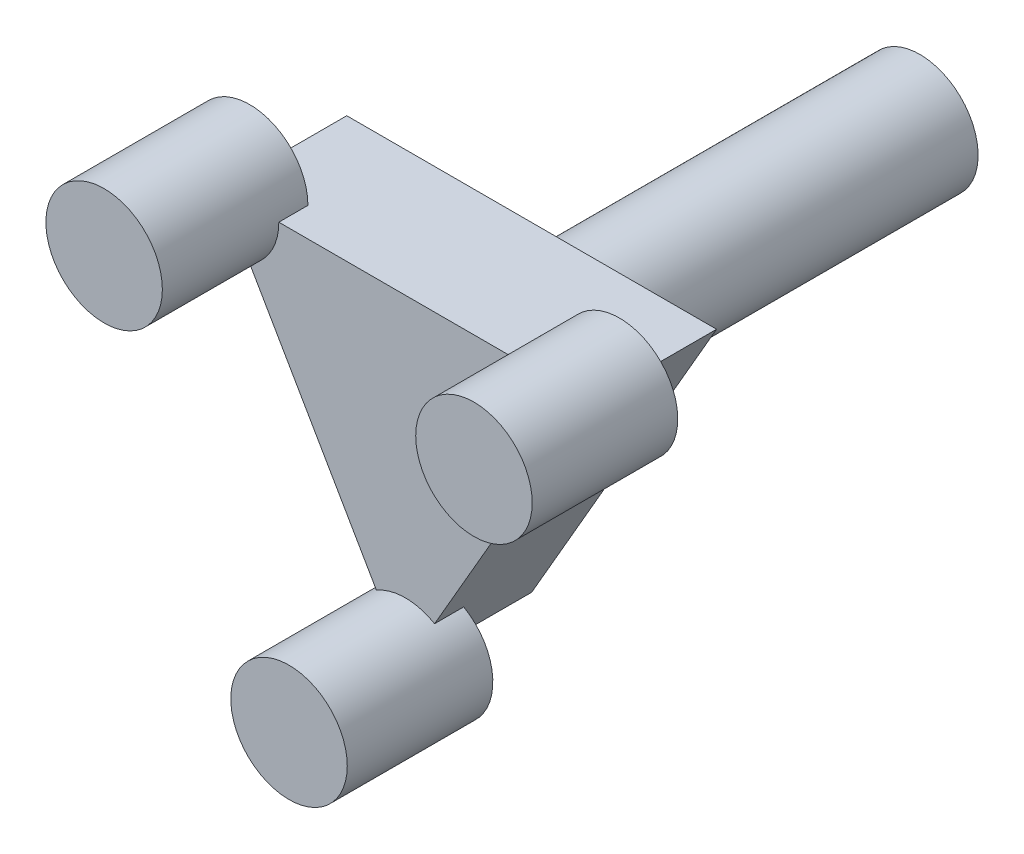
ISO-10303-21;
HEADER;
FILE_DESCRIPTION(('STEP AP214'),'2;1');
FILE_NAME('part.step','',(''),(''),'','','');
FILE_SCHEMA(('AUTOMOTIVE_DESIGN { 1 0 10303 214 1 1 1 1 }'));
ENDSEC;
DATA;
#1=APPLICATION_CONTEXT('core data for automotive mechanical design processes');
#2=APPLICATION_PROTOCOL_DEFINITION('international standard','automotive_design',2000,#1);
#3=PRODUCT_CONTEXT('',#1,'mechanical');
#4=PRODUCT('Part','Part','',(#3));
#5=PRODUCT_RELATED_PRODUCT_CATEGORY('part','',(#4));
#6=PRODUCT_DEFINITION_FORMATION('','',#4);
#7=PRODUCT_DEFINITION_CONTEXT('part definition',#1,'design');
#8=PRODUCT_DEFINITION('design','',#6,#7);
#9=PRODUCT_DEFINITION_SHAPE('','',#8);
#10=(LENGTH_UNIT() NAMED_UNIT(*) SI_UNIT(.MILLI.,.METRE.));
#11=(NAMED_UNIT(*) PLANE_ANGLE_UNIT() SI_UNIT($,.RADIAN.));
#12=(NAMED_UNIT(*) SI_UNIT($,.STERADIAN.) SOLID_ANGLE_UNIT());
#13=UNCERTAINTY_MEASURE_WITH_UNIT(LENGTH_MEASURE(1.E-05),#10,'distance_accuracy_value','');
#14=(GEOMETRIC_REPRESENTATION_CONTEXT(3) GLOBAL_UNCERTAINTY_ASSIGNED_CONTEXT((#13)) GLOBAL_UNIT_ASSIGNED_CONTEXT((#10,
#11,#12)) REPRESENTATION_CONTEXT('',''));
#15=CARTESIAN_POINT('',(0.,0.,0.));
#16=DIRECTION('',(0.,0.,1.));
#17=DIRECTION('',(1.,0.,0.));
#18=AXIS2_PLACEMENT_3D('',#15,#16,#17);
#19=CARTESIAN_POINT('',(-19.0525588832587,-10.9999999999975,-9.99999999999996));
#20=DIRECTION('',(0.,-1.,0.));
#21=DIRECTION('',(0.,0.,-1.));
#22=AXIS2_PLACEMENT_3D('',#19,#20,#21);
#23=PLANE('',#22);
#24=DIRECTION('',(0.,0.,-1.));
#25=VECTOR('',#24,1.);
#26=CARTESIAN_POINT('',(-13.0525588832545,-10.9999999999975,15.));
#27=LINE('',#26,#25);
#28=CARTESIAN_POINT('',(-13.0525588832545,-10.9999999999975,3.));
#29=VERTEX_POINT('',#28);
#30=CARTESIAN_POINT('',(-13.0525588832545,-10.9999999999975,0.));
#31=VERTEX_POINT('',#30);
#32=EDGE_CURVE('E126',#29,#31,#27,.T.);
#33=ORIENTED_EDGE('',*,*,#32,.F.);
#34=DIRECTION('',(1.,0.,0.));
#35=VECTOR('',#34,1.);
#36=CARTESIAN_POINT('',(-19.0525588832587,-10.9999999999975,3.));
#37=LINE('',#36,#35);
#38=CARTESIAN_POINT('',(13.0525588832415,-10.9999999999975,3.));
#39=VERTEX_POINT('',#38);
#40=EDGE_CURVE('E114',#29,#39,#37,.T.);
#41=ORIENTED_EDGE('',*,*,#40,.T.);
#42=DIRECTION('',(0.,0.,-1.));
#43=VECTOR('',#42,1.);
#44=CARTESIAN_POINT('',(13.0525588832415,-10.9999999999975,15.));
#45=LINE('',#44,#43);
#46=CARTESIAN_POINT('',(13.0525588832415,-10.9999999999975,0.));
#47=VERTEX_POINT('',#46);
#48=EDGE_CURVE('E203',#47,#39,#45,.F.);
#49=ORIENTED_EDGE('',*,*,#48,.F.);
#50=DIRECTION('',(-1.,0.,0.));
#51=VECTOR('',#50,1.);
#52=CARTESIAN_POINT('',(-19.0525588832587,-10.9999999999975,0.));
#53=LINE('',#52,#51);
#54=CARTESIAN_POINT('',(19.0525588832485,-10.9999999999975,0.));
#55=VERTEX_POINT('',#54);
#56=EDGE_CURVE('E134',#55,#47,#53,.T.);
#57=ORIENTED_EDGE('',*,*,#56,.F.);
#58=DIRECTION('',(0.,0.,1.));
#59=VECTOR('',#58,1.);
#60=CARTESIAN_POINT('',(19.0525588832485,-10.9999999999975,-9.99999999999996));
#61=LINE('',#60,#59);
#62=CARTESIAN_POINT('',(19.0525588832485,-10.9999999999975,-9.99999999999996));
#63=VERTEX_POINT('',#62);
#64=EDGE_CURVE('E170',#63,#55,#61,.T.);
#65=ORIENTED_EDGE('',*,*,#64,.F.);
#66=DIRECTION('',(1.,0.,0.));
#67=VECTOR('',#66,1.);
#68=CARTESIAN_POINT('',(-19.0525588832587,-10.9999999999975,-9.99999999999996));
#69=LINE('',#68,#67);
#70=CARTESIAN_POINT('',(-19.0525588832587,-10.9999999999975,-9.99999999999996));
#71=VERTEX_POINT('',#70);
#72=EDGE_CURVE('E185',#71,#63,#69,.T.);
#73=ORIENTED_EDGE('',*,*,#72,.F.);
#74=DIRECTION('',(0.,0.,1.));
#75=VECTOR('',#74,1.);
#76=CARTESIAN_POINT('',(-19.0525588832587,-10.9999999999975,-9.99999999999996));
#77=LINE('',#76,#75);
#78=CARTESIAN_POINT('',(-19.0525588832587,-10.9999999999975,0.));
#79=VERTEX_POINT('',#78);
#80=EDGE_CURVE('E178',#71,#79,#77,.T.);
#81=ORIENTED_EDGE('',*,*,#80,.T.);
#82=DIRECTION('',(-1.,0.,0.));
#83=VECTOR('',#82,1.);
#84=CARTESIAN_POINT('',(-19.0525588832587,-10.9999999999975,0.));
#85=LINE('',#84,#83);
#86=EDGE_CURVE('E56',#31,#79,#85,.T.);
#87=ORIENTED_EDGE('',*,*,#86,.F.);
#88=EDGE_LOOP('',(#33,#41,#49,#57,#65,#73,#81,#87));
#89=FACE_BOUND('',#88,.T.);
#90=ADVANCED_FACE('F39',(#89),#23,.F.);
#91=CARTESIAN_POINT('',(-4.61615936060342E-12,-43.9999999999913,-9.99999999999996));
#92=DIRECTION('',(0.866025403784439,0.5,0.));
#93=DIRECTION('',(-0.5,0.866025403784439,0.));
#94=AXIS2_PLACEMENT_3D('',#91,#92,#93);
#95=PLANE('',#94);
#96=DIRECTION('',(0.,0.,-1.));
#97=VECTOR('',#96,1.);
#98=CARTESIAN_POINT('',(-16.0525588832566,-16.1961524227078,15.));
#99=LINE('',#98,#97);
#100=CARTESIAN_POINT('',(-16.0525588832566,-16.1961524227078,0.));
#101=VERTEX_POINT('',#100);
#102=CARTESIAN_POINT('',(-16.0525588832566,-16.1961524227078,3.));
#103=VERTEX_POINT('',#102);
#104=EDGE_CURVE('E64',#101,#103,#99,.F.);
#105=ORIENTED_EDGE('',*,*,#104,.F.);
#106=DIRECTION('',(0.5,-0.866025403784439,0.));
#107=VECTOR('',#106,1.);
#108=CARTESIAN_POINT('',(-4.61615936060342E-12,-43.9999999999913,0.));
#109=LINE('',#108,#107);
#110=EDGE_CURVE('E43',#79,#101,#109,.T.);
#111=ORIENTED_EDGE('',*,*,#110,.F.);
#112=ORIENTED_EDGE('',*,*,#80,.F.);
#113=DIRECTION('',(-0.5,0.866025403784439,0.));
#114=VECTOR('',#113,1.);
#115=CARTESIAN_POINT('',(-4.61615936060342E-12,-43.9999999999913,-9.99999999999996));
#116=LINE('',#115,#114);
#117=CARTESIAN_POINT('',(-4.61615936060342E-12,-43.9999999999913,-9.99999999999996));
#118=VERTEX_POINT('',#117);
#119=EDGE_CURVE('E181',#118,#71,#116,.T.);
#120=ORIENTED_EDGE('',*,*,#119,.F.);
#121=DIRECTION('',(0.,0.,1.));
#122=VECTOR('',#121,1.);
#123=CARTESIAN_POINT('',(-4.61615936060342E-12,-43.9999999999913,-9.99999999999996));
#124=LINE('',#123,#122);
#125=CARTESIAN_POINT('',(-4.61532925508023E-12,-43.9999999999913,0.));
#126=VERTEX_POINT('',#125);
#127=EDGE_CURVE('E174',#118,#126,#124,.T.);
#128=ORIENTED_EDGE('',*,*,#127,.T.);
#129=DIRECTION('',(-0.5,0.866025403784439,0.));
#130=VECTOR('',#129,1.);
#131=CARTESIAN_POINT('',(-4.61615936060342E-12,-43.9999999999913,0.));
#132=LINE('',#131,#130);
#133=CARTESIAN_POINT('',(-3.00000000000237,-38.8038475772886,0.));
#134=VERTEX_POINT('',#133);
#135=EDGE_CURVE('E150',#126,#134,#132,.T.);
#136=ORIENTED_EDGE('',*,*,#135,.T.);
#137=DIRECTION('',(0.,0.,-1.));
#138=VECTOR('',#137,1.);
#139=CARTESIAN_POINT('',(-3.00000000000237,-38.8038475772886,15.));
#140=LINE('',#139,#138);
#141=CARTESIAN_POINT('',(-3.00000000000237,-38.8038475772886,3.));
#142=VERTEX_POINT('',#141);
#143=EDGE_CURVE('E166',#134,#142,#140,.F.);
#144=ORIENTED_EDGE('',*,*,#143,.T.);
#145=DIRECTION('',(-0.5,0.866025403784439,0.));
#146=VECTOR('',#145,1.);
#147=CARTESIAN_POINT('',(-4.61615936060342E-12,-43.9999999999913,3.));
#148=LINE('',#147,#146);
#149=EDGE_CURVE('E182',#142,#103,#148,.T.);
#150=ORIENTED_EDGE('',*,*,#149,.T.);
#151=EDGE_LOOP('',(#105,#111,#112,#120,#128,#136,#144,#150));
#152=FACE_BOUND('',#151,.T.);
#153=ADVANCED_FACE('F260',(#152),#95,.F.);
#154=CARTESIAN_POINT('',(19.0525588832485,-10.9999999999975,-9.99999999999996));
#155=DIRECTION('',(-0.866025403784449,0.499999999999981,0.));
#156=DIRECTION('',(-0.499999999999981,-0.866025403784449,0.));
#157=AXIS2_PLACEMENT_3D('',#154,#155,#156);
#158=PLANE('',#157);
#159=DIRECTION('',(0.,0.,-1.));
#160=VECTOR('',#159,1.);
#161=CARTESIAN_POINT('',(16.0525588832451,-16.1961524227103,15.));
#162=LINE('',#161,#160);
#163=CARTESIAN_POINT('',(16.0525588832451,-16.1961524227103,3.));
#164=VERTEX_POINT('',#163);
#165=CARTESIAN_POINT('',(16.0525588832451,-16.1961524227103,0.));
#166=VERTEX_POINT('',#165);
#167=EDGE_CURVE('E199',#164,#166,#162,.T.);
#168=ORIENTED_EDGE('',*,*,#167,.F.);
#169=DIRECTION('',(-0.499999999999981,-0.866025403784449,0.));
#170=VECTOR('',#169,1.);
#171=CARTESIAN_POINT('',(19.0525588832485,-10.9999999999975,3.));
#172=LINE('',#171,#170);
#173=CARTESIAN_POINT('',(2.99999999999303,-38.8038475772885,3.));
#174=VERTEX_POINT('',#173);
#175=EDGE_CURVE('E123',#164,#174,#172,.T.);
#176=ORIENTED_EDGE('',*,*,#175,.T.);
#177=DIRECTION('',(0.,0.,-1.));
#178=VECTOR('',#177,1.);
#179=CARTESIAN_POINT('',(2.99999999999302,-38.8038475772885,15.));
#180=LINE('',#179,#178);
#181=CARTESIAN_POINT('',(2.99999999999303,-38.8038475772885,0.));
#182=VERTEX_POINT('',#181);
#183=EDGE_CURVE('E159',#174,#182,#180,.T.);
#184=ORIENTED_EDGE('',*,*,#183,.T.);
#185=DIRECTION('',(-0.499999999999981,-0.866025403784449,0.));
#186=VECTOR('',#185,1.);
#187=CARTESIAN_POINT('',(-4.61615936060342E-12,-43.9999999999913,0.));
#188=LINE('',#187,#186);
#189=EDGE_CURVE('E146',#182,#126,#188,.T.);
#190=ORIENTED_EDGE('',*,*,#189,.T.);
#191=ORIENTED_EDGE('',*,*,#127,.F.);
#192=DIRECTION('',(-0.499999999999981,-0.866025403784449,0.));
#193=VECTOR('',#192,1.);
#194=CARTESIAN_POINT('',(19.0525588832485,-10.9999999999975,-9.99999999999996));
#195=LINE('',#194,#193);
#196=EDGE_CURVE('E190',#63,#118,#195,.T.);
#197=ORIENTED_EDGE('',*,*,#196,.F.);
#198=ORIENTED_EDGE('',*,*,#64,.T.);
#199=DIRECTION('',(0.499999999999981,0.866025403784449,0.));
#200=VECTOR('',#199,1.);
#201=CARTESIAN_POINT('',(19.0525588832485,-10.9999999999975,0.));
#202=LINE('',#201,#200);
#203=EDGE_CURVE('E124',#166,#55,#202,.T.);
#204=ORIENTED_EDGE('',*,*,#203,.F.);
#205=EDGE_LOOP('',(#168,#176,#184,#190,#191,#197,#198,#204));
#206=FACE_BOUND('',#205,.T.);
#207=ADVANCED_FACE('F251',(#206),#158,.F.);
#208=CARTESIAN_POINT('',(-4.61615936060342E-12,-43.9999999999913,15.));
#209=DIRECTION('',(0.,0.,-1.));
#210=DIRECTION('',(-1.,0.,0.));
#211=AXIS2_PLACEMENT_3D('',#208,#209,#210);
#212=CYLINDRICAL_SURFACE('',#211,5.99999999999551);
#213=CARTESIAN_POINT('',(-4.61615936060342E-12,-43.9999999999913,15.));
#214=DIRECTION('',(0.,0.,1.));
#215=DIRECTION('',(1.,0.,0.));
#216=AXIS2_PLACEMENT_3D('',#213,#214,#215);
#217=CIRCLE('',#216,5.99999999999551);
#218=CARTESIAN_POINT('',(5.99999999999089,-43.9999999999913,15.));
#219=VERTEX_POINT('',#218);
#220=EDGE_CURVE('E154',#219,#219,#217,.T.);
#221=ORIENTED_EDGE('',*,*,#220,.F.);
#222=EDGE_LOOP('',(#221));
#223=FACE_BOUND('',#222,.T.);
#224=ORIENTED_EDGE('',*,*,#183,.F.);
#225=CARTESIAN_POINT('',(-4.61615936060342E-12,-43.9999999999913,3.));
#226=DIRECTION('',(0.,0.,-1.));
#227=DIRECTION('',(-1.,0.,0.));
#228=AXIS2_PLACEMENT_3D('',#225,#226,#227);
#229=CIRCLE('',#228,5.99999999999551);
#230=EDGE_CURVE('E142',#142,#174,#229,.T.);
#231=ORIENTED_EDGE('',*,*,#230,.F.);
#232=ORIENTED_EDGE('',*,*,#143,.F.);
#233=CARTESIAN_POINT('',(-4.61615936060342E-12,-43.9999999999913,0.));
#234=DIRECTION('',(0.,0.,1.));
#235=DIRECTION('',(1.,0.,0.));
#236=AXIS2_PLACEMENT_3D('',#233,#234,#235);
#237=CIRCLE('',#236,5.99999999999551);
#238=EDGE_CURVE('E155',#134,#182,#237,.T.);
#239=ORIENTED_EDGE('',*,*,#238,.T.);
#240=EDGE_LOOP('',(#224,#231,#232,#239));
#241=FACE_BOUND('',#240,.T.);
#242=ADVANCED_FACE('F41',(#223,#241),#212,.T.);
#243=CARTESIAN_POINT('',(-4.61615936060342E-12,-43.9999999999913,0.));
#244=DIRECTION('',(0.,0.,1.));
#245=DIRECTION('',(1.,0.,0.));
#246=AXIS2_PLACEMENT_3D('',#243,#244,#245);
#247=PLANE('',#246);
#248=ORIENTED_EDGE('',*,*,#189,.F.);
#249=ORIENTED_EDGE('',*,*,#238,.F.);
#250=ORIENTED_EDGE('',*,*,#135,.F.);
#251=EDGE_LOOP('',(#248,#249,#250));
#252=FACE_BOUND('',#251,.T.);
#253=ADVANCED_FACE('F262',(#252),#247,.F.);
#254=CARTESIAN_POINT('',(-4.61615936060342E-12,-43.9999999999913,15.));
#255=DIRECTION('',(0.,0.,1.));
#256=DIRECTION('',(1.,0.,0.));
#257=AXIS2_PLACEMENT_3D('',#254,#255,#256);
#258=PLANE('',#257);
#259=ORIENTED_EDGE('',*,*,#220,.T.);
#260=EDGE_LOOP('',(#259));
#261=FACE_BOUND('',#260,.T.);
#262=ADVANCED_FACE('F242',(#261),#258,.T.);
#263=CARTESIAN_POINT('',(0.,0.,-9.99999999999996));
#264=DIRECTION('',(0.,0.,-1.));
#265=DIRECTION('',(-1.,0.,0.));
#266=AXIS2_PLACEMENT_3D('',#263,#264,#265);
#267=PLANE('',#266);
#268=CARTESIAN_POINT('',(0.,-21.9999999999983,-9.99999999999996));
#269=DIRECTION('',(0.,0.,-1.));
#270=DIRECTION('',(-1.,0.,0.));
#271=AXIS2_PLACEMENT_3D('',#268,#269,#270);
#272=CIRCLE('',#271,6.);
#273=CARTESIAN_POINT('',(-6.,-21.9999999999983,-9.99999999999996));
#274=VERTEX_POINT('',#273);
#275=EDGE_CURVE('E11',#274,#274,#272,.T.);
#276=ORIENTED_EDGE('',*,*,#275,.F.);
#277=EDGE_LOOP('',(#276));
#278=FACE_BOUND('',#277,.T.);
#279=ORIENTED_EDGE('',*,*,#72,.T.);
#280=ORIENTED_EDGE('',*,*,#196,.T.);
#281=ORIENTED_EDGE('',*,*,#119,.T.);
#282=EDGE_LOOP('',(#279,#280,#281));
#283=FACE_BOUND('',#282,.T.);
#284=ADVANCED_FACE('F239',(#278,#283),#267,.T.);
#285=CARTESIAN_POINT('',(0.,0.,3.));
#286=DIRECTION('',(0.,0.,-1.));
#287=DIRECTION('',(-1.,0.,0.));
#288=AXIS2_PLACEMENT_3D('',#285,#286,#287);
#289=PLANE('',#288);
#290=CARTESIAN_POINT('',(-19.0525588832587,-10.9999999999975,3.));
#291=DIRECTION('',(0.,0.,-1.));
#292=DIRECTION('',(-1.,0.,0.));
#293=AXIS2_PLACEMENT_3D('',#290,#291,#292);
#294=CIRCLE('',#293,6.00000000000415);
#295=EDGE_CURVE('E118',#103,#29,#294,.F.);
#296=ORIENTED_EDGE('',*,*,#295,.F.);
#297=ORIENTED_EDGE('',*,*,#149,.F.);
#298=ORIENTED_EDGE('',*,*,#230,.T.);
#299=ORIENTED_EDGE('',*,*,#175,.F.);
#300=CARTESIAN_POINT('',(19.0525588832485,-10.9999999999975,3.));
#301=DIRECTION('',(0.,0.,-1.));
#302=DIRECTION('',(-1.,0.,0.));
#303=AXIS2_PLACEMENT_3D('',#300,#301,#302);
#304=CIRCLE('',#303,6.00000000000703);
#305=EDGE_CURVE('E120',#39,#164,#304,.F.);
#306=ORIENTED_EDGE('',*,*,#305,.F.);
#307=ORIENTED_EDGE('',*,*,#40,.F.);
#308=EDGE_LOOP('',(#296,#297,#298,#299,#306,#307));
#309=FACE_BOUND('',#308,.T.);
#310=ADVANCED_FACE('F115',(#309),#289,.F.);
#311=CARTESIAN_POINT('',(19.0525588832485,-10.9999999999975,0.));
#312=DIRECTION('',(0.,0.,1.));
#313=DIRECTION('',(1.,0.,0.));
#314=AXIS2_PLACEMENT_3D('',#311,#312,#313);
#315=PLANE('',#314);
#316=CARTESIAN_POINT('',(19.0525588832485,-10.9999999999975,0.));
#317=DIRECTION('',(0.,0.,1.));
#318=DIRECTION('',(1.,0.,0.));
#319=AXIS2_PLACEMENT_3D('',#316,#317,#318);
#320=CIRCLE('',#319,6.00000000000703);
#321=EDGE_CURVE('E207',#166,#47,#320,.T.);
#322=ORIENTED_EDGE('',*,*,#321,.F.);
#323=ORIENTED_EDGE('',*,*,#203,.T.);
#324=ORIENTED_EDGE('',*,*,#56,.T.);
#325=EDGE_LOOP('',(#322,#323,#324));
#326=FACE_BOUND('',#325,.T.);
#327=ADVANCED_FACE('F254',(#326),#315,.F.);
#328=CARTESIAN_POINT('',(19.0525588832485,-10.9999999999975,15.));
#329=DIRECTION('',(0.,0.,-1.));
#330=DIRECTION('',(-1.,0.,0.));
#331=AXIS2_PLACEMENT_3D('',#328,#329,#330);
#332=CYLINDRICAL_SURFACE('',#331,6.00000000000703);
#333=CARTESIAN_POINT('',(19.0525588832485,-10.9999999999975,15.));
#334=DIRECTION('',(0.,0.,1.));
#335=DIRECTION('',(1.,0.,0.));
#336=AXIS2_PLACEMENT_3D('',#333,#334,#335);
#337=CIRCLE('',#336,6.00000000000703);
#338=CARTESIAN_POINT('',(25.0525588832555,-10.9999999999975,15.));
#339=VERTEX_POINT('',#338);
#340=EDGE_CURVE('E206',#339,#339,#337,.T.);
#341=ORIENTED_EDGE('',*,*,#340,.F.);
#342=EDGE_LOOP('',(#341));
#343=FACE_BOUND('',#342,.T.);
#344=ORIENTED_EDGE('',*,*,#305,.T.);
#345=ORIENTED_EDGE('',*,*,#167,.T.);
#346=ORIENTED_EDGE('',*,*,#321,.T.);
#347=ORIENTED_EDGE('',*,*,#48,.T.);
#348=EDGE_LOOP('',(#344,#345,#346,#347));
#349=FACE_BOUND('',#348,.T.);
#350=ADVANCED_FACE('F256',(#343,#349),#332,.T.);
#351=CARTESIAN_POINT('',(19.0525588832485,-10.9999999999975,15.));
#352=DIRECTION('',(0.,0.,1.));
#353=DIRECTION('',(1.,0.,0.));
#354=AXIS2_PLACEMENT_3D('',#351,#352,#353);
#355=PLANE('',#354);
#356=ORIENTED_EDGE('',*,*,#340,.T.);
#357=EDGE_LOOP('',(#356));
#358=FACE_BOUND('',#357,.T.);
#359=ADVANCED_FACE('F266',(#358),#355,.T.);
#360=CARTESIAN_POINT('',(-19.0525588832587,-10.9999999999975,0.));
#361=DIRECTION('',(0.,0.,1.));
#362=DIRECTION('',(1.,0.,0.));
#363=AXIS2_PLACEMENT_3D('',#360,#361,#362);
#364=PLANE('',#363);
#365=CARTESIAN_POINT('',(-19.0525588832587,-10.9999999999975,0.));
#366=DIRECTION('',(0.,0.,1.));
#367=DIRECTION('',(1.,0.,0.));
#368=AXIS2_PLACEMENT_3D('',#365,#366,#367);
#369=CIRCLE('',#368,6.00000000000415);
#370=EDGE_CURVE('E219',#31,#101,#369,.T.);
#371=ORIENTED_EDGE('',*,*,#370,.F.);
#372=ORIENTED_EDGE('',*,*,#86,.T.);
#373=ORIENTED_EDGE('',*,*,#110,.T.);
#374=EDGE_LOOP('',(#371,#372,#373));
#375=FACE_BOUND('',#374,.T.);
#376=ADVANCED_FACE('F264',(#375),#364,.F.);
#377=CARTESIAN_POINT('',(-19.0525588832587,-10.9999999999975,15.));
#378=DIRECTION('',(0.,0.,-1.));
#379=DIRECTION('',(-1.,0.,0.));
#380=AXIS2_PLACEMENT_3D('',#377,#378,#379);
#381=CYLINDRICAL_SURFACE('',#380,6.00000000000415);
#382=CARTESIAN_POINT('',(-19.0525588832587,-10.9999999999975,15.));
#383=DIRECTION('',(0.,0.,1.));
#384=DIRECTION('',(1.,0.,0.));
#385=AXIS2_PLACEMENT_3D('',#382,#383,#384);
#386=CIRCLE('',#385,6.00000000000415);
#387=CARTESIAN_POINT('',(-13.0525588832545,-10.9999999999975,15.));
#388=VERTEX_POINT('',#387);
#389=EDGE_CURVE('E218',#388,#388,#386,.T.);
#390=ORIENTED_EDGE('',*,*,#389,.F.);
#391=EDGE_LOOP('',(#390));
#392=FACE_BOUND('',#391,.T.);
#393=ORIENTED_EDGE('',*,*,#295,.T.);
#394=ORIENTED_EDGE('',*,*,#32,.T.);
#395=ORIENTED_EDGE('',*,*,#370,.T.);
#396=ORIENTED_EDGE('',*,*,#104,.T.);
#397=EDGE_LOOP('',(#393,#394,#395,#396));
#398=FACE_BOUND('',#397,.T.);
#399=ADVANCED_FACE('F132',(#392,#398),#381,.T.);
#400=CARTESIAN_POINT('',(-19.0525588832587,-10.9999999999975,15.));
#401=DIRECTION('',(0.,0.,1.));
#402=DIRECTION('',(1.,0.,0.));
#403=AXIS2_PLACEMENT_3D('',#400,#401,#402);
#404=PLANE('',#403);
#405=ORIENTED_EDGE('',*,*,#389,.T.);
#406=EDGE_LOOP('',(#405));
#407=FACE_BOUND('',#406,.T.);
#408=ADVANCED_FACE('F235',(#407),#404,.T.);
#409=CARTESIAN_POINT('',(0.,-21.9999999999983,-50.));
#410=DIRECTION('',(0.,0.,1.));
#411=DIRECTION('',(1.,0.,0.));
#412=AXIS2_PLACEMENT_3D('',#409,#410,#411);
#413=CYLINDRICAL_SURFACE('',#412,6.);
#414=CARTESIAN_POINT('',(0.,-21.9999999999983,-50.));
#415=DIRECTION('',(0.,0.,-1.));
#416=DIRECTION('',(-1.,0.,0.));
#417=AXIS2_PLACEMENT_3D('',#414,#415,#416);
#418=CIRCLE('',#417,6.);
#419=CARTESIAN_POINT('',(-6.,-21.9999999999983,-50.));
#420=VERTEX_POINT('',#419);
#421=EDGE_CURVE('E222',#420,#420,#418,.T.);
#422=ORIENTED_EDGE('',*,*,#421,.F.);
#423=EDGE_LOOP('',(#422));
#424=FACE_BOUND('',#423,.T.);
#425=ORIENTED_EDGE('',*,*,#275,.T.);
#426=EDGE_LOOP('',(#425));
#427=FACE_BOUND('',#426,.T.);
#428=ADVANCED_FACE('F232',(#424,#427),#413,.T.);
#429=CARTESIAN_POINT('',(0.,-21.9999999999983,-50.));
#430=DIRECTION('',(0.,0.,-1.));
#431=DIRECTION('',(-1.,0.,0.));
#432=AXIS2_PLACEMENT_3D('',#429,#430,#431);
#433=PLANE('',#432);
#434=ORIENTED_EDGE('',*,*,#421,.T.);
#435=EDGE_LOOP('',(#434));
#436=FACE_BOUND('',#435,.T.);
#437=ADVANCED_FACE('F230',(#436),#433,.T.);
#438=CLOSED_SHELL('',(#90,#153,#207,#242,#253,#262,#284,#310,#327,#350,#359,#376,#399,#408,#428,#437));
#439=MANIFOLD_SOLID_BREP('B2',#438);
#440=ADVANCED_BREP_SHAPE_REPRESENTATION('',(#18,#439),#14);
#441=SHAPE_DEFINITION_REPRESENTATION(#9,#440);
ENDSEC;
END-ISO-10303-21;
